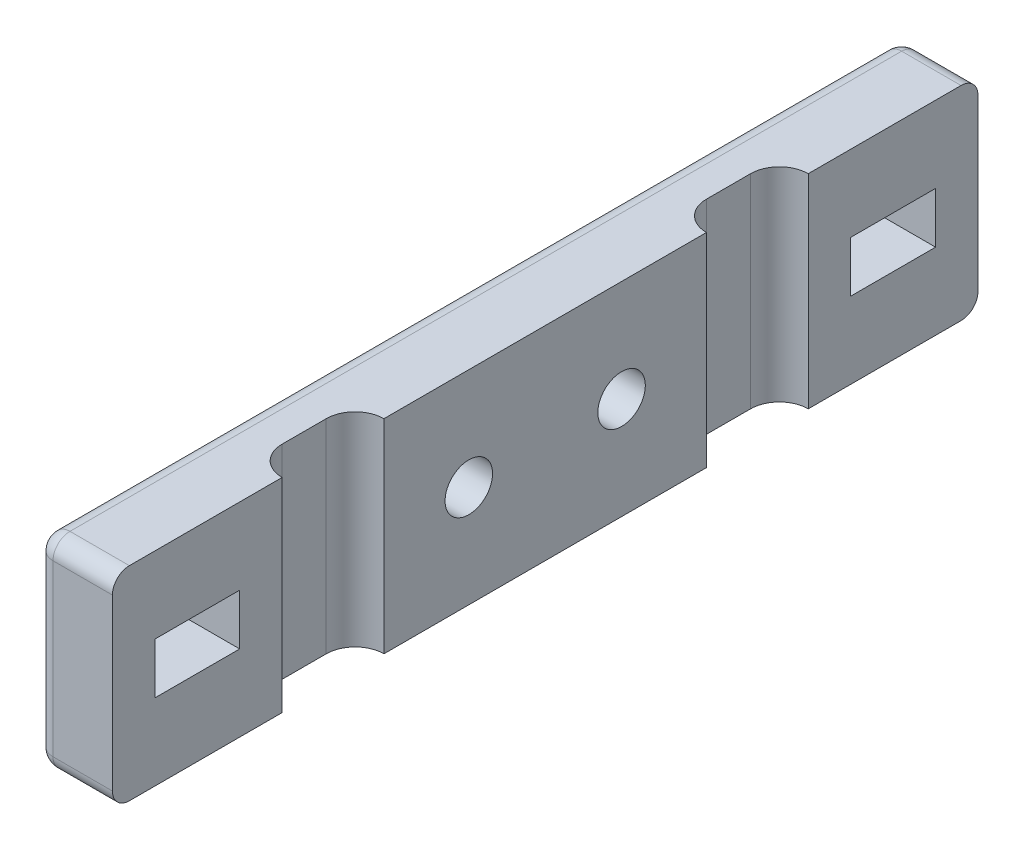
ISO-10303-21;
HEADER;
FILE_DESCRIPTION(('STEP AP214'),'2;1');
FILE_NAME('part.step','',(''),(''),'','','');
FILE_SCHEMA(('AUTOMOTIVE_DESIGN { 1 0 10303 214 1 1 1 1 }'));
ENDSEC;
DATA;
#1=APPLICATION_CONTEXT('core data for automotive mechanical design processes');
#2=APPLICATION_PROTOCOL_DEFINITION('international standard','automotive_design',2000,#1);
#3=PRODUCT_CONTEXT('',#1,'mechanical');
#4=PRODUCT('Part','Part','',(#3));
#5=PRODUCT_RELATED_PRODUCT_CATEGORY('part','',(#4));
#6=PRODUCT_DEFINITION_FORMATION('','',#4);
#7=PRODUCT_DEFINITION_CONTEXT('part definition',#1,'design');
#8=PRODUCT_DEFINITION('design','',#6,#7);
#9=PRODUCT_DEFINITION_SHAPE('','',#8);
#10=(LENGTH_UNIT() NAMED_UNIT(*) SI_UNIT(.MILLI.,.METRE.));
#11=(NAMED_UNIT(*) PLANE_ANGLE_UNIT() SI_UNIT($,.RADIAN.));
#12=(NAMED_UNIT(*) SI_UNIT($,.STERADIAN.) SOLID_ANGLE_UNIT());
#13=UNCERTAINTY_MEASURE_WITH_UNIT(LENGTH_MEASURE(1.E-05),#10,'distance_accuracy_value','');
#14=(GEOMETRIC_REPRESENTATION_CONTEXT(3) GLOBAL_UNCERTAINTY_ASSIGNED_CONTEXT((#13)) GLOBAL_UNIT_ASSIGNED_CONTEXT((#10,
#11,#12)) REPRESENTATION_CONTEXT('',''));
#15=CARTESIAN_POINT('',(0.,0.,0.));
#16=DIRECTION('',(0.,0.,1.));
#17=DIRECTION('',(1.,0.,0.));
#18=AXIS2_PLACEMENT_3D('',#15,#16,#17);
#19=CARTESIAN_POINT('',(0.,12.,-25.5));
#20=DIRECTION('',(1.,0.,0.));
#21=DIRECTION('',(0.,0.,-1.));
#22=AXIS2_PLACEMENT_3D('',#19,#20,#21);
#23=PLANE('',#22);
#24=DIRECTION('',(0.,-1.,0.));
#25=VECTOR('',#24,1.);
#26=CARTESIAN_POINT('',(0.,12.,-24.5));
#27=LINE('',#26,#25);
#28=CARTESIAN_POINT('',(0.,11.,-24.5));
#29=VERTEX_POINT('',#28);
#30=CARTESIAN_POINT('',(0.,1.,-24.5));
#31=VERTEX_POINT('',#30);
#32=EDGE_CURVE('E351',#29,#31,#27,.T.);
#33=ORIENTED_EDGE('',*,*,#32,.T.);
#34=DIRECTION('',(0.,0.,1.));
#35=VECTOR('',#34,1.);
#36=CARTESIAN_POINT('',(0.,1.,-25.5));
#37=LINE('',#36,#35);
#38=CARTESIAN_POINT('',(0.,1.,24.5));
#39=VERTEX_POINT('',#38);
#40=EDGE_CURVE('E355',#31,#39,#37,.T.);
#41=ORIENTED_EDGE('',*,*,#40,.T.);
#42=DIRECTION('',(0.,-1.,0.));
#43=VECTOR('',#42,1.);
#44=CARTESIAN_POINT('',(0.,12.,24.5));
#45=LINE('',#44,#43);
#46=CARTESIAN_POINT('',(0.,11.,24.5));
#47=VERTEX_POINT('',#46);
#48=EDGE_CURVE('E353',#39,#47,#45,.F.);
#49=ORIENTED_EDGE('',*,*,#48,.T.);
#50=DIRECTION('',(0.,0.,1.));
#51=VECTOR('',#50,1.);
#52=CARTESIAN_POINT('',(0.,11.,-25.5));
#53=LINE('',#52,#51);
#54=EDGE_CURVE('E349',#47,#29,#53,.F.);
#55=ORIENTED_EDGE('',*,*,#54,.T.);
#56=EDGE_LOOP('',(#33,#41,#49,#55));
#57=FACE_BOUND('',#56,.T.);
#58=DIRECTION('',(0.,0.,1.));
#59=VECTOR('',#58,1.);
#60=CARTESIAN_POINT('',(0.,4.5,18.));
#61=LINE('',#60,#59);
#62=CARTESIAN_POINT('',(0.,4.5,18.));
#63=VERTEX_POINT('',#62);
#64=CARTESIAN_POINT('',(0.,4.5,23.));
#65=VERTEX_POINT('',#64);
#66=EDGE_CURVE('E273',#63,#65,#61,.T.);
#67=ORIENTED_EDGE('',*,*,#66,.F.);
#68=DIRECTION('',(0.,-1.,0.));
#69=VECTOR('',#68,1.);
#70=CARTESIAN_POINT('',(0.,7.5,18.));
#71=LINE('',#70,#69);
#72=CARTESIAN_POINT('',(0.,7.5,18.));
#73=VERTEX_POINT('',#72);
#74=EDGE_CURVE('E270',#73,#63,#71,.T.);
#75=ORIENTED_EDGE('',*,*,#74,.F.);
#76=DIRECTION('',(0.,0.,-1.));
#77=VECTOR('',#76,1.);
#78=CARTESIAN_POINT('',(0.,7.5,18.));
#79=LINE('',#78,#77);
#80=CARTESIAN_POINT('',(0.,7.5,23.));
#81=VERTEX_POINT('',#80);
#82=EDGE_CURVE('E247',#81,#73,#79,.T.);
#83=ORIENTED_EDGE('',*,*,#82,.F.);
#84=DIRECTION('',(0.,1.,0.));
#85=VECTOR('',#84,1.);
#86=CARTESIAN_POINT('',(0.,7.5,23.));
#87=LINE('',#86,#85);
#88=EDGE_CURVE('E244',#65,#81,#87,.T.);
#89=ORIENTED_EDGE('',*,*,#88,.F.);
#90=EDGE_LOOP('',(#67,#75,#83,#89));
#91=FACE_BOUND('',#90,.T.);
#92=CARTESIAN_POINT('',(0.,6.,-4.5));
#93=DIRECTION('',(1.,0.,0.));
#94=DIRECTION('',(0.,0.,-1.));
#95=AXIS2_PLACEMENT_3D('',#92,#93,#94);
#96=CIRCLE('',#95,1.4);
#97=CARTESIAN_POINT('',(0.,6.,-5.9));
#98=VERTEX_POINT('',#97);
#99=EDGE_CURVE('E240',#98,#98,#96,.F.);
#100=ORIENTED_EDGE('',*,*,#99,.F.);
#101=EDGE_LOOP('',(#100));
#102=FACE_BOUND('',#101,.T.);
#103=DIRECTION('',(0.,0.,-1.));
#104=VECTOR('',#103,1.);
#105=CARTESIAN_POINT('',(0.,7.5,-18.));
#106=LINE('',#105,#104);
#107=CARTESIAN_POINT('',(0.,7.5,-18.));
#108=VERTEX_POINT('',#107);
#109=CARTESIAN_POINT('',(0.,7.5,-23.));
#110=VERTEX_POINT('',#109);
#111=EDGE_CURVE('E214',#108,#110,#106,.T.);
#112=ORIENTED_EDGE('',*,*,#111,.F.);
#113=DIRECTION('',(0.,1.,0.));
#114=VECTOR('',#113,1.);
#115=CARTESIAN_POINT('',(0.,7.5,-18.));
#116=LINE('',#115,#114);
#117=CARTESIAN_POINT('',(0.,4.5,-18.));
#118=VERTEX_POINT('',#117);
#119=EDGE_CURVE('E224',#118,#108,#116,.T.);
#120=ORIENTED_EDGE('',*,*,#119,.F.);
#121=DIRECTION('',(0.,0.,1.));
#122=VECTOR('',#121,1.);
#123=CARTESIAN_POINT('',(0.,4.5,-18.));
#124=LINE('',#123,#122);
#125=CARTESIAN_POINT('',(0.,4.5,-23.));
#126=VERTEX_POINT('',#125);
#127=EDGE_CURVE('E221',#126,#118,#124,.T.);
#128=ORIENTED_EDGE('',*,*,#127,.F.);
#129=DIRECTION('',(0.,-1.,0.));
#130=VECTOR('',#129,1.);
#131=CARTESIAN_POINT('',(0.,7.5,-23.));
#132=LINE('',#131,#130);
#133=EDGE_CURVE('E234',#110,#126,#132,.T.);
#134=ORIENTED_EDGE('',*,*,#133,.F.);
#135=EDGE_LOOP('',(#112,#120,#128,#134));
#136=FACE_BOUND('',#135,.T.);
#137=CARTESIAN_POINT('',(0.,6.,4.5));
#138=DIRECTION('',(1.,0.,0.));
#139=DIRECTION('',(0.,0.,-1.));
#140=AXIS2_PLACEMENT_3D('',#137,#138,#139);
#141=CIRCLE('',#140,1.4);
#142=CARTESIAN_POINT('',(0.,6.,3.1));
#143=VERTEX_POINT('',#142);
#144=EDGE_CURVE('E279',#143,#143,#141,.F.);
#145=ORIENTED_EDGE('',*,*,#144,.F.);
#146=EDGE_LOOP('',(#145));
#147=FACE_BOUND('',#146,.T.);
#148=ADVANCED_FACE('F37',(#57,#91,#102,#136,#147),#23,.F.);
#149=CARTESIAN_POINT('',(0.,12.,25.5));
#150=DIRECTION('',(0.,0.,-1.));
#151=DIRECTION('',(-1.,0.,0.));
#152=AXIS2_PLACEMENT_3D('',#149,#150,#151);
#153=PLANE('',#152);
#154=DIRECTION('',(0.,-1.,0.));
#155=VECTOR('',#154,1.);
#156=CARTESIAN_POINT('',(1.00000000000001,12.,25.5));
#157=LINE('',#156,#155);
#158=CARTESIAN_POINT('',(1.00000000000001,11.,25.5));
#159=VERTEX_POINT('',#158);
#160=CARTESIAN_POINT('',(1.00000000000001,1.,25.5));
#161=VERTEX_POINT('',#160);
#162=EDGE_CURVE('E367',#159,#161,#157,.T.);
#163=ORIENTED_EDGE('',*,*,#162,.T.);
#164=DIRECTION('',(1.,0.,0.));
#165=VECTOR('',#164,1.);
#166=CARTESIAN_POINT('',(0.,1.,25.5));
#167=LINE('',#166,#165);
#168=CARTESIAN_POINT('',(4.5,1.,25.5));
#169=VERTEX_POINT('',#168);
#170=EDGE_CURVE('E369',#161,#169,#167,.T.);
#171=ORIENTED_EDGE('',*,*,#170,.T.);
#172=DIRECTION('',(0.,-1.,0.));
#173=VECTOR('',#172,1.);
#174=CARTESIAN_POINT('',(4.5,12.,25.5));
#175=LINE('',#174,#173);
#176=CARTESIAN_POINT('',(4.5,11.,25.5));
#177=VERTEX_POINT('',#176);
#178=EDGE_CURVE('E346',#177,#169,#175,.T.);
#179=ORIENTED_EDGE('',*,*,#178,.F.);
#180=DIRECTION('',(1.,0.,0.));
#181=VECTOR('',#180,1.);
#182=CARTESIAN_POINT('',(0.,11.,25.5));
#183=LINE('',#182,#181);
#184=EDGE_CURVE('E365',#177,#159,#183,.F.);
#185=ORIENTED_EDGE('',*,*,#184,.T.);
#186=EDGE_LOOP('',(#163,#171,#179,#185));
#187=FACE_BOUND('',#186,.T.);
#188=ADVANCED_FACE('F515',(#187),#153,.F.);
#189=CARTESIAN_POINT('',(4.5,12.,15.5));
#190=DIRECTION('',(-1.,0.,0.));
#191=DIRECTION('',(0.,0.,1.));
#192=AXIS2_PLACEMENT_3D('',#189,#190,#191);
#193=PLANE('',#192);
#194=DIRECTION('',(0.,0.,1.));
#195=VECTOR('',#194,1.);
#196=CARTESIAN_POINT('',(4.5,7.5,18.));
#197=LINE('',#196,#195);
#198=CARTESIAN_POINT('',(4.5,7.5,18.));
#199=VERTEX_POINT('',#198);
#200=CARTESIAN_POINT('',(4.50000000000001,7.5,23.));
#201=VERTEX_POINT('',#200);
#202=EDGE_CURVE('E265',#199,#201,#197,.T.);
#203=ORIENTED_EDGE('',*,*,#202,.F.);
#204=DIRECTION('',(0.,1.,0.));
#205=VECTOR('',#204,1.);
#206=CARTESIAN_POINT('',(4.5,7.5,18.));
#207=LINE('',#206,#205);
#208=CARTESIAN_POINT('',(4.5,4.5,18.));
#209=VERTEX_POINT('',#208);
#210=EDGE_CURVE('E268',#209,#199,#207,.T.);
#211=ORIENTED_EDGE('',*,*,#210,.F.);
#212=DIRECTION('',(0.,0.,-1.));
#213=VECTOR('',#212,1.);
#214=CARTESIAN_POINT('',(4.5,4.5,18.));
#215=LINE('',#214,#213);
#216=CARTESIAN_POINT('',(4.50000000000001,4.5,23.));
#217=VERTEX_POINT('',#216);
#218=EDGE_CURVE('E254',#217,#209,#215,.T.);
#219=ORIENTED_EDGE('',*,*,#218,.F.);
#220=DIRECTION('',(0.,-1.,0.));
#221=VECTOR('',#220,1.);
#222=CARTESIAN_POINT('',(4.50000000000001,7.5,23.));
#223=LINE('',#222,#221);
#224=EDGE_CURVE('E262',#201,#217,#223,.T.);
#225=ORIENTED_EDGE('',*,*,#224,.F.);
#226=EDGE_LOOP('',(#203,#211,#219,#225));
#227=FACE_BOUND('',#226,.T.);
#228=ORIENTED_EDGE('',*,*,#178,.T.);
#229=CARTESIAN_POINT('',(4.5,1.,24.5));
#230=DIRECTION('',(-1.,0.,0.));
#231=DIRECTION('',(0.,0.,1.));
#232=AXIS2_PLACEMENT_3D('',#229,#230,#231);
#233=CIRCLE('',#232,1.);
#234=CARTESIAN_POINT('',(4.5,0.,24.5));
#235=VERTEX_POINT('',#234);
#236=EDGE_CURVE('E11',#169,#235,#233,.F.);
#237=ORIENTED_EDGE('',*,*,#236,.T.);
#238=DIRECTION('',(0.,0.,-1.));
#239=VECTOR('',#238,1.);
#240=CARTESIAN_POINT('',(4.5,0.,15.5));
#241=LINE('',#240,#239);
#242=CARTESIAN_POINT('',(4.5,0.,15.5));
#243=VERTEX_POINT('',#242);
#244=EDGE_CURVE('E282',#235,#243,#241,.T.);
#245=ORIENTED_EDGE('',*,*,#244,.T.);
#246=DIRECTION('',(0.,-1.,0.));
#247=VECTOR('',#246,1.);
#248=CARTESIAN_POINT('',(4.5,12.,15.5));
#249=LINE('',#248,#247);
#250=CARTESIAN_POINT('',(4.5,12.,15.5));
#251=VERTEX_POINT('',#250);
#252=EDGE_CURVE('E343',#251,#243,#249,.T.);
#253=ORIENTED_EDGE('',*,*,#252,.F.);
#254=DIRECTION('',(0.,0.,-1.));
#255=VECTOR('',#254,1.);
#256=CARTESIAN_POINT('',(4.5,12.,15.5));
#257=LINE('',#256,#255);
#258=CARTESIAN_POINT('',(4.5,12.,24.5));
#259=VERTEX_POINT('',#258);
#260=EDGE_CURVE('E283',#259,#251,#257,.T.);
#261=ORIENTED_EDGE('',*,*,#260,.F.);
#262=CARTESIAN_POINT('',(4.5,11.,24.5));
#263=DIRECTION('',(-1.,0.,0.));
#264=DIRECTION('',(0.,0.,1.));
#265=AXIS2_PLACEMENT_3D('',#262,#263,#264);
#266=CIRCLE('',#265,1.);
#267=EDGE_CURVE('E46',#259,#177,#266,.F.);
#268=ORIENTED_EDGE('',*,*,#267,.T.);
#269=EDGE_LOOP('',(#228,#237,#245,#253,#261,#268));
#270=FACE_BOUND('',#269,.T.);
#271=ADVANCED_FACE('F451',(#227,#270),#193,.F.);
#272=CARTESIAN_POINT('',(4.5,12.,13.8));
#273=DIRECTION('',(0.,-1.,0.));
#274=DIRECTION('',(0.,0.,-1.));
#275=AXIS2_PLACEMENT_3D('',#272,#273,#274);
#276=CYLINDRICAL_SURFACE('',#275,1.7);
#277=CARTESIAN_POINT('',(4.5,0.,13.8));
#278=DIRECTION('',(0.,-1.,0.));
#279=DIRECTION('',(0.,0.,1.));
#280=AXIS2_PLACEMENT_3D('',#277,#278,#279);
#281=CIRCLE('',#280,1.7);
#282=CARTESIAN_POINT('',(2.8,0.,13.8));
#283=VERTEX_POINT('',#282);
#284=EDGE_CURVE('E304',#243,#283,#281,.T.);
#285=ORIENTED_EDGE('',*,*,#284,.T.);
#286=DIRECTION('',(0.,-1.,0.));
#287=VECTOR('',#286,1.);
#288=CARTESIAN_POINT('',(2.8,12.,13.8));
#289=LINE('',#288,#287);
#290=CARTESIAN_POINT('',(2.8,12.,13.8));
#291=VERTEX_POINT('',#290);
#292=EDGE_CURVE('E340',#291,#283,#289,.T.);
#293=ORIENTED_EDGE('',*,*,#292,.F.);
#294=CARTESIAN_POINT('',(4.5,12.,13.8));
#295=DIRECTION('',(0.,-1.,0.));
#296=DIRECTION('',(0.,0.,1.));
#297=AXIS2_PLACEMENT_3D('',#294,#295,#296);
#298=CIRCLE('',#297,1.7);
#299=EDGE_CURVE('E285',#251,#291,#298,.T.);
#300=ORIENTED_EDGE('',*,*,#299,.F.);
#301=ORIENTED_EDGE('',*,*,#252,.T.);
#302=EDGE_LOOP('',(#285,#293,#300,#301));
#303=FACE_BOUND('',#302,.T.);
#304=ADVANCED_FACE('F458',(#303),#276,.F.);
#305=CARTESIAN_POINT('',(2.8,12.,13.8));
#306=DIRECTION('',(-1.,0.,0.));
#307=DIRECTION('',(0.,0.,1.));
#308=AXIS2_PLACEMENT_3D('',#305,#306,#307);
#309=PLANE('',#308);
#310=DIRECTION('',(0.,0.,-1.));
#311=VECTOR('',#310,1.);
#312=CARTESIAN_POINT('',(2.8,0.,13.8));
#313=LINE('',#312,#311);
#314=CARTESIAN_POINT('',(2.8,0.,11.2));
#315=VERTEX_POINT('',#314);
#316=EDGE_CURVE('E306',#283,#315,#313,.T.);
#317=ORIENTED_EDGE('',*,*,#316,.T.);
#318=DIRECTION('',(0.,-1.,0.));
#319=VECTOR('',#318,1.);
#320=CARTESIAN_POINT('',(2.8,12.,11.2));
#321=LINE('',#320,#319);
#322=CARTESIAN_POINT('',(2.8,12.,11.2));
#323=VERTEX_POINT('',#322);
#324=EDGE_CURVE('E337',#323,#315,#321,.T.);
#325=ORIENTED_EDGE('',*,*,#324,.F.);
#326=DIRECTION('',(0.,0.,-1.));
#327=VECTOR('',#326,1.);
#328=CARTESIAN_POINT('',(2.8,12.,13.8));
#329=LINE('',#328,#327);
#330=EDGE_CURVE('E288',#291,#323,#329,.T.);
#331=ORIENTED_EDGE('',*,*,#330,.F.);
#332=ORIENTED_EDGE('',*,*,#292,.T.);
#333=EDGE_LOOP('',(#317,#325,#331,#332));
#334=FACE_BOUND('',#333,.T.);
#335=ADVANCED_FACE('F464',(#334),#309,.F.);
#336=CARTESIAN_POINT('',(4.5,12.,11.2));
#337=DIRECTION('',(0.,-1.,0.));
#338=DIRECTION('',(0.,0.,-1.));
#339=AXIS2_PLACEMENT_3D('',#336,#337,#338);
#340=CYLINDRICAL_SURFACE('',#339,1.7);
#341=CARTESIAN_POINT('',(4.5,0.,11.2));
#342=DIRECTION('',(0.,-1.,0.));
#343=DIRECTION('',(0.,0.,-1.));
#344=AXIS2_PLACEMENT_3D('',#341,#342,#343);
#345=CIRCLE('',#344,1.7);
#346=CARTESIAN_POINT('',(4.5,0.,9.5));
#347=VERTEX_POINT('',#346);
#348=EDGE_CURVE('E308',#315,#347,#345,.T.);
#349=ORIENTED_EDGE('',*,*,#348,.T.);
#350=DIRECTION('',(0.,-1.,0.));
#351=VECTOR('',#350,1.);
#352=CARTESIAN_POINT('',(4.5,12.,9.5));
#353=LINE('',#352,#351);
#354=CARTESIAN_POINT('',(4.5,12.,9.5));
#355=VERTEX_POINT('',#354);
#356=EDGE_CURVE('E334',#355,#347,#353,.T.);
#357=ORIENTED_EDGE('',*,*,#356,.F.);
#358=CARTESIAN_POINT('',(4.5,12.,11.2));
#359=DIRECTION('',(0.,-1.,0.));
#360=DIRECTION('',(0.,0.,-1.));
#361=AXIS2_PLACEMENT_3D('',#358,#359,#360);
#362=CIRCLE('',#361,1.7);
#363=EDGE_CURVE('E290',#323,#355,#362,.T.);
#364=ORIENTED_EDGE('',*,*,#363,.F.);
#365=ORIENTED_EDGE('',*,*,#324,.T.);
#366=EDGE_LOOP('',(#349,#357,#364,#365));
#367=FACE_BOUND('',#366,.T.);
#368=ADVANCED_FACE('F468',(#367),#340,.F.);
#369=CARTESIAN_POINT('',(4.5,12.,-9.5));
#370=DIRECTION('',(-1.,0.,0.));
#371=DIRECTION('',(0.,0.,1.));
#372=AXIS2_PLACEMENT_3D('',#369,#370,#371);
#373=PLANE('',#372);
#374=CARTESIAN_POINT('',(4.5,6.,-4.5));
#375=DIRECTION('',(1.,0.,0.));
#376=DIRECTION('',(0.,0.,1.));
#377=AXIS2_PLACEMENT_3D('',#374,#375,#376);
#378=CIRCLE('',#377,1.4);
#379=CARTESIAN_POINT('',(4.5,6.,-3.1));
#380=VERTEX_POINT('',#379);
#381=EDGE_CURVE('E243',#380,#380,#378,.T.);
#382=ORIENTED_EDGE('',*,*,#381,.F.);
#383=EDGE_LOOP('',(#382));
#384=FACE_BOUND('',#383,.T.);
#385=CARTESIAN_POINT('',(4.5,6.,4.5));
#386=DIRECTION('',(1.,0.,0.));
#387=DIRECTION('',(0.,0.,-1.));
#388=AXIS2_PLACEMENT_3D('',#385,#386,#387);
#389=CIRCLE('',#388,1.4);
#390=CARTESIAN_POINT('',(4.5,6.,3.1));
#391=VERTEX_POINT('',#390);
#392=EDGE_CURVE('E236',#391,#391,#389,.T.);
#393=ORIENTED_EDGE('',*,*,#392,.F.);
#394=EDGE_LOOP('',(#393));
#395=FACE_BOUND('',#394,.T.);
#396=DIRECTION('',(0.,0.,-1.));
#397=VECTOR('',#396,1.);
#398=CARTESIAN_POINT('',(4.5,0.,-9.5));
#399=LINE('',#398,#397);
#400=CARTESIAN_POINT('',(4.5,0.,-9.5));
#401=VERTEX_POINT('',#400);
#402=EDGE_CURVE('E310',#347,#401,#399,.T.);
#403=ORIENTED_EDGE('',*,*,#402,.T.);
#404=DIRECTION('',(0.,-1.,0.));
#405=VECTOR('',#404,1.);
#406=CARTESIAN_POINT('',(4.5,12.,-9.5));
#407=LINE('',#406,#405);
#408=CARTESIAN_POINT('',(4.5,12.,-9.5));
#409=VERTEX_POINT('',#408);
#410=EDGE_CURVE('E331',#409,#401,#407,.T.);
#411=ORIENTED_EDGE('',*,*,#410,.F.);
#412=DIRECTION('',(0.,0.,-1.));
#413=VECTOR('',#412,1.);
#414=CARTESIAN_POINT('',(4.5,12.,-9.5));
#415=LINE('',#414,#413);
#416=EDGE_CURVE('E292',#355,#409,#415,.T.);
#417=ORIENTED_EDGE('',*,*,#416,.F.);
#418=ORIENTED_EDGE('',*,*,#356,.T.);
#419=EDGE_LOOP('',(#403,#411,#417,#418));
#420=FACE_BOUND('',#419,.T.);
#421=ADVANCED_FACE('F473',(#384,#395,#420),#373,.F.);
#422=CARTESIAN_POINT('',(4.5,12.,-11.2));
#423=DIRECTION('',(0.,-1.,0.));
#424=DIRECTION('',(0.,0.,-1.));
#425=AXIS2_PLACEMENT_3D('',#422,#423,#424);
#426=CYLINDRICAL_SURFACE('',#425,1.7);
#427=CARTESIAN_POINT('',(4.5,0.,-11.2));
#428=DIRECTION('',(0.,-1.,0.));
#429=DIRECTION('',(0.,0.,1.));
#430=AXIS2_PLACEMENT_3D('',#427,#428,#429);
#431=CIRCLE('',#430,1.7);
#432=CARTESIAN_POINT('',(2.8,0.,-11.2));
#433=VERTEX_POINT('',#432);
#434=EDGE_CURVE('E312',#401,#433,#431,.T.);
#435=ORIENTED_EDGE('',*,*,#434,.T.);
#436=DIRECTION('',(0.,-1.,0.));
#437=VECTOR('',#436,1.);
#438=CARTESIAN_POINT('',(2.8,12.,-11.2));
#439=LINE('',#438,#437);
#440=CARTESIAN_POINT('',(2.8,12.,-11.2));
#441=VERTEX_POINT('',#440);
#442=EDGE_CURVE('E328',#441,#433,#439,.T.);
#443=ORIENTED_EDGE('',*,*,#442,.F.);
#444=CARTESIAN_POINT('',(4.5,12.,-11.2));
#445=DIRECTION('',(0.,-1.,0.));
#446=DIRECTION('',(0.,0.,1.));
#447=AXIS2_PLACEMENT_3D('',#444,#445,#446);
#448=CIRCLE('',#447,1.7);
#449=EDGE_CURVE('E294',#409,#441,#448,.T.);
#450=ORIENTED_EDGE('',*,*,#449,.F.);
#451=ORIENTED_EDGE('',*,*,#410,.T.);
#452=EDGE_LOOP('',(#435,#443,#450,#451));
#453=FACE_BOUND('',#452,.T.);
#454=ADVANCED_FACE('F479',(#453),#426,.F.);
#455=CARTESIAN_POINT('',(2.8,12.,-11.2));
#456=DIRECTION('',(-1.,0.,0.));
#457=DIRECTION('',(0.,0.,1.));
#458=AXIS2_PLACEMENT_3D('',#455,#456,#457);
#459=PLANE('',#458);
#460=DIRECTION('',(0.,0.,-1.));
#461=VECTOR('',#460,1.);
#462=CARTESIAN_POINT('',(2.8,0.,-11.2));
#463=LINE('',#462,#461);
#464=CARTESIAN_POINT('',(2.8,0.,-13.8));
#465=VERTEX_POINT('',#464);
#466=EDGE_CURVE('E314',#433,#465,#463,.T.);
#467=ORIENTED_EDGE('',*,*,#466,.T.);
#468=DIRECTION('',(0.,-1.,0.));
#469=VECTOR('',#468,1.);
#470=CARTESIAN_POINT('',(2.8,12.,-13.8));
#471=LINE('',#470,#469);
#472=CARTESIAN_POINT('',(2.8,12.,-13.8));
#473=VERTEX_POINT('',#472);
#474=EDGE_CURVE('E325',#473,#465,#471,.T.);
#475=ORIENTED_EDGE('',*,*,#474,.F.);
#476=DIRECTION('',(0.,0.,-1.));
#477=VECTOR('',#476,1.);
#478=CARTESIAN_POINT('',(2.8,12.,-11.2));
#479=LINE('',#478,#477);
#480=EDGE_CURVE('E296',#441,#473,#479,.T.);
#481=ORIENTED_EDGE('',*,*,#480,.F.);
#482=ORIENTED_EDGE('',*,*,#442,.T.);
#483=EDGE_LOOP('',(#467,#475,#481,#482));
#484=FACE_BOUND('',#483,.T.);
#485=ADVANCED_FACE('F483',(#484),#459,.F.);
#486=CARTESIAN_POINT('',(4.5,12.,-13.8));
#487=DIRECTION('',(0.,-1.,0.));
#488=DIRECTION('',(0.,0.,-1.));
#489=AXIS2_PLACEMENT_3D('',#486,#487,#488);
#490=CYLINDRICAL_SURFACE('',#489,1.7);
#491=CARTESIAN_POINT('',(4.5,0.,-13.8));
#492=DIRECTION('',(0.,-1.,0.));
#493=DIRECTION('',(0.,0.,-1.));
#494=AXIS2_PLACEMENT_3D('',#491,#492,#493);
#495=CIRCLE('',#494,1.7);
#496=CARTESIAN_POINT('',(4.5,0.,-15.5));
#497=VERTEX_POINT('',#496);
#498=EDGE_CURVE('E316',#465,#497,#495,.T.);
#499=ORIENTED_EDGE('',*,*,#498,.T.);
#500=DIRECTION('',(0.,-1.,0.));
#501=VECTOR('',#500,1.);
#502=CARTESIAN_POINT('',(4.5,12.,-15.5));
#503=LINE('',#502,#501);
#504=CARTESIAN_POINT('',(4.5,12.,-15.5));
#505=VERTEX_POINT('',#504);
#506=EDGE_CURVE('E322',#505,#497,#503,.T.);
#507=ORIENTED_EDGE('',*,*,#506,.F.);
#508=CARTESIAN_POINT('',(4.5,12.,-13.8));
#509=DIRECTION('',(0.,-1.,0.));
#510=DIRECTION('',(0.,0.,-1.));
#511=AXIS2_PLACEMENT_3D('',#508,#509,#510);
#512=CIRCLE('',#511,1.7);
#513=EDGE_CURVE('E298',#473,#505,#512,.T.);
#514=ORIENTED_EDGE('',*,*,#513,.F.);
#515=ORIENTED_EDGE('',*,*,#474,.T.);
#516=EDGE_LOOP('',(#499,#507,#514,#515));
#517=FACE_BOUND('',#516,.T.);
#518=ADVANCED_FACE('F488',(#517),#490,.F.);
#519=CARTESIAN_POINT('',(4.5,12.,-25.5));
#520=DIRECTION('',(-1.,0.,0.));
#521=DIRECTION('',(0.,0.,1.));
#522=AXIS2_PLACEMENT_3D('',#519,#520,#521);
#523=PLANE('',#522);
#524=DIRECTION('',(0.,0.,-1.));
#525=VECTOR('',#524,1.);
#526=CARTESIAN_POINT('',(4.5,4.5,-18.));
#527=LINE('',#526,#525);
#528=CARTESIAN_POINT('',(4.5,4.5,-18.));
#529=VERTEX_POINT('',#528);
#530=CARTESIAN_POINT('',(4.5,4.5,-23.));
#531=VERTEX_POINT('',#530);
#532=EDGE_CURVE('E922',#529,#531,#527,.T.);
#533=ORIENTED_EDGE('',*,*,#532,.F.);
#534=DIRECTION('',(0.,-1.,0.));
#535=VECTOR('',#534,1.);
#536=CARTESIAN_POINT('',(4.5,7.5,-18.));
#537=LINE('',#536,#535);
#538=CARTESIAN_POINT('',(4.5,7.5,-18.));
#539=VERTEX_POINT('',#538);
#540=EDGE_CURVE('E231',#539,#529,#537,.T.);
#541=ORIENTED_EDGE('',*,*,#540,.F.);
#542=DIRECTION('',(0.,0.,1.));
#543=VECTOR('',#542,1.);
#544=CARTESIAN_POINT('',(4.5,7.5,-18.));
#545=LINE('',#544,#543);
#546=CARTESIAN_POINT('',(4.5,7.5,-23.));
#547=VERTEX_POINT('',#546);
#548=EDGE_CURVE('E217',#547,#539,#545,.T.);
#549=ORIENTED_EDGE('',*,*,#548,.F.);
#550=DIRECTION('',(0.,1.,0.));
#551=VECTOR('',#550,1.);
#552=CARTESIAN_POINT('',(4.5,7.5,-23.));
#553=LINE('',#552,#551);
#554=EDGE_CURVE('E930',#531,#547,#553,.T.);
#555=ORIENTED_EDGE('',*,*,#554,.F.);
#556=EDGE_LOOP('',(#533,#541,#549,#555));
#557=FACE_BOUND('',#556,.T.);
#558=DIRECTION('',(0.,-1.,0.));
#559=VECTOR('',#558,1.);
#560=CARTESIAN_POINT('',(4.5,12.,-25.5));
#561=LINE('',#560,#559);
#562=CARTESIAN_POINT('',(4.5,11.,-25.5));
#563=VERTEX_POINT('',#562);
#564=CARTESIAN_POINT('',(4.5,1.,-25.5));
#565=VERTEX_POINT('',#564);
#566=EDGE_CURVE('E302',#563,#565,#561,.T.);
#567=ORIENTED_EDGE('',*,*,#566,.F.);
#568=CARTESIAN_POINT('',(4.5,11.,-24.5));
#569=DIRECTION('',(-1.,0.,0.));
#570=DIRECTION('',(0.,0.,1.));
#571=AXIS2_PLACEMENT_3D('',#568,#569,#570);
#572=CIRCLE('',#571,1.);
#573=CARTESIAN_POINT('',(4.5,12.,-24.5));
#574=VERTEX_POINT('',#573);
#575=EDGE_CURVE('E383',#563,#574,#572,.F.);
#576=ORIENTED_EDGE('',*,*,#575,.T.);
#577=DIRECTION('',(0.,0.,-1.));
#578=VECTOR('',#577,1.);
#579=CARTESIAN_POINT('',(4.5,12.,-25.5));
#580=LINE('',#579,#578);
#581=EDGE_CURVE('E300',#505,#574,#580,.T.);
#582=ORIENTED_EDGE('',*,*,#581,.F.);
#583=ORIENTED_EDGE('',*,*,#506,.T.);
#584=DIRECTION('',(0.,0.,-1.));
#585=VECTOR('',#584,1.);
#586=CARTESIAN_POINT('',(4.5,0.,-25.5));
#587=LINE('',#586,#585);
#588=CARTESIAN_POINT('',(4.5,0.,-24.5));
#589=VERTEX_POINT('',#588);
#590=EDGE_CURVE('E286',#497,#589,#587,.T.);
#591=ORIENTED_EDGE('',*,*,#590,.T.);
#592=CARTESIAN_POINT('',(4.5,1.,-24.5));
#593=DIRECTION('',(-1.,0.,0.));
#594=DIRECTION('',(0.,0.,1.));
#595=AXIS2_PLACEMENT_3D('',#592,#593,#594);
#596=CIRCLE('',#595,1.);
#597=EDGE_CURVE('E381',#589,#565,#596,.F.);
#598=ORIENTED_EDGE('',*,*,#597,.T.);
#599=EDGE_LOOP('',(#567,#576,#582,#583,#591,#598));
#600=FACE_BOUND('',#599,.T.);
#601=ADVANCED_FACE('F493',(#557,#600),#523,.F.);
#602=CARTESIAN_POINT('',(0.,12.,-25.5));
#603=DIRECTION('',(0.,0.,1.));
#604=DIRECTION('',(1.,0.,0.));
#605=AXIS2_PLACEMENT_3D('',#602,#603,#604);
#606=PLANE('',#605);
#607=DIRECTION('',(0.,-1.,0.));
#608=VECTOR('',#607,1.);
#609=CARTESIAN_POINT('',(1.00000000000001,12.,-25.5));
#610=LINE('',#609,#608);
#611=CARTESIAN_POINT('',(1.00000000000001,1.,-25.5));
#612=VERTEX_POINT('',#611);
#613=CARTESIAN_POINT('',(1.00000000000001,11.,-25.5));
#614=VERTEX_POINT('',#613);
#615=EDGE_CURVE('E373',#612,#614,#610,.F.);
#616=ORIENTED_EDGE('',*,*,#615,.T.);
#617=DIRECTION('',(-1.,0.,0.));
#618=VECTOR('',#617,1.);
#619=CARTESIAN_POINT('',(4.5,11.,-25.5));
#620=LINE('',#619,#618);
#621=EDGE_CURVE('E375',#614,#563,#620,.F.);
#622=ORIENTED_EDGE('',*,*,#621,.T.);
#623=ORIENTED_EDGE('',*,*,#566,.T.);
#624=DIRECTION('',(-1.,0.,0.));
#625=VECTOR('',#624,1.);
#626=CARTESIAN_POINT('',(0.,1.,-25.5));
#627=LINE('',#626,#625);
#628=EDGE_CURVE('E371',#565,#612,#627,.T.);
#629=ORIENTED_EDGE('',*,*,#628,.T.);
#630=EDGE_LOOP('',(#616,#622,#623,#629));
#631=FACE_BOUND('',#630,.T.);
#632=ADVANCED_FACE('F497',(#631),#606,.F.);
#633=CARTESIAN_POINT('',(4.5,12.,13.8));
#634=DIRECTION('',(0.,1.,0.));
#635=DIRECTION('',(0.,0.,1.));
#636=AXIS2_PLACEMENT_3D('',#633,#634,#635);
#637=PLANE('',#636);
#638=ORIENTED_EDGE('',*,*,#581,.T.);
#639=DIRECTION('',(-1.,0.,0.));
#640=VECTOR('',#639,1.);
#641=CARTESIAN_POINT('',(0.,12.,-24.5));
#642=LINE('',#641,#640);
#643=CARTESIAN_POINT('',(1.00000000000001,12.,-24.5));
#644=VERTEX_POINT('',#643);
#645=EDGE_CURVE('E54',#574,#644,#642,.T.);
#646=ORIENTED_EDGE('',*,*,#645,.T.);
#647=DIRECTION('',(0.,0.,1.));
#648=VECTOR('',#647,1.);
#649=CARTESIAN_POINT('',(1.00000000000001,12.,25.5));
#650=LINE('',#649,#648);
#651=CARTESIAN_POINT('',(1.00000000000001,12.,24.5));
#652=VERTEX_POINT('',#651);
#653=EDGE_CURVE('E58',#644,#652,#650,.T.);
#654=ORIENTED_EDGE('',*,*,#653,.T.);
#655=DIRECTION('',(1.,0.,0.));
#656=VECTOR('',#655,1.);
#657=CARTESIAN_POINT('',(4.5,12.,24.5));
#658=LINE('',#657,#656);
#659=EDGE_CURVE('E377',#652,#259,#658,.T.);
#660=ORIENTED_EDGE('',*,*,#659,.T.);
#661=ORIENTED_EDGE('',*,*,#260,.T.);
#662=ORIENTED_EDGE('',*,*,#299,.T.);
#663=ORIENTED_EDGE('',*,*,#330,.T.);
#664=ORIENTED_EDGE('',*,*,#363,.T.);
#665=ORIENTED_EDGE('',*,*,#416,.T.);
#666=ORIENTED_EDGE('',*,*,#449,.T.);
#667=ORIENTED_EDGE('',*,*,#480,.T.);
#668=ORIENTED_EDGE('',*,*,#513,.T.);
#669=EDGE_LOOP('',(#638,#646,#654,#660,#661,#662,#663,#664,#665,#666,#667,#668));
#670=FACE_BOUND('',#669,.T.);
#671=ADVANCED_FACE('F448',(#670),#637,.T.);
#672=CARTESIAN_POINT('',(4.5,0.,13.8));
#673=DIRECTION('',(0.,1.,0.));
#674=DIRECTION('',(0.,0.,1.));
#675=AXIS2_PLACEMENT_3D('',#672,#673,#674);
#676=PLANE('',#675);
#677=DIRECTION('',(0.,0.,1.));
#678=VECTOR('',#677,1.);
#679=CARTESIAN_POINT('',(1.00000000000001,0.,13.8));
#680=LINE('',#679,#678);
#681=CARTESIAN_POINT('',(1.00000000000001,0.,24.5));
#682=VERTEX_POINT('',#681);
#683=CARTESIAN_POINT('',(1.00000000000001,0.,-24.5));
#684=VERTEX_POINT('',#683);
#685=EDGE_CURVE('E360',#682,#684,#680,.F.);
#686=ORIENTED_EDGE('',*,*,#685,.T.);
#687=DIRECTION('',(-1.,0.,0.));
#688=VECTOR('',#687,1.);
#689=CARTESIAN_POINT('',(4.5,0.,-24.5));
#690=LINE('',#689,#688);
#691=EDGE_CURVE('E363',#684,#589,#690,.F.);
#692=ORIENTED_EDGE('',*,*,#691,.T.);
#693=ORIENTED_EDGE('',*,*,#590,.F.);
#694=ORIENTED_EDGE('',*,*,#498,.F.);
#695=ORIENTED_EDGE('',*,*,#466,.F.);
#696=ORIENTED_EDGE('',*,*,#434,.F.);
#697=ORIENTED_EDGE('',*,*,#402,.F.);
#698=ORIENTED_EDGE('',*,*,#348,.F.);
#699=ORIENTED_EDGE('',*,*,#316,.F.);
#700=ORIENTED_EDGE('',*,*,#284,.F.);
#701=ORIENTED_EDGE('',*,*,#244,.F.);
#702=DIRECTION('',(1.,0.,0.));
#703=VECTOR('',#702,1.);
#704=CARTESIAN_POINT('',(4.5,0.,24.5));
#705=LINE('',#704,#703);
#706=EDGE_CURVE('E358',#235,#682,#705,.F.);
#707=ORIENTED_EDGE('',*,*,#706,.T.);
#708=EDGE_LOOP('',(#686,#692,#693,#694,#695,#696,#697,#698,#699,#700,#701,#707));
#709=FACE_BOUND('',#708,.T.);
#710=ADVANCED_FACE('F521',(#709),#676,.F.);
#711=CARTESIAN_POINT('',(-0.00100000000000187,7.5,-18.));
#712=DIRECTION('',(0.,0.,1.));
#713=DIRECTION('',(1.,0.,0.));
#714=AXIS2_PLACEMENT_3D('',#711,#712,#713);
#715=PLANE('',#714);
#716=ORIENTED_EDGE('',*,*,#119,.T.);
#717=DIRECTION('',(1.,0.,0.));
#718=VECTOR('',#717,1.);
#719=CARTESIAN_POINT('',(-0.00100000000000187,7.5,-18.));
#720=LINE('',#719,#718);
#721=EDGE_CURVE('E210',#108,#539,#720,.T.);
#722=ORIENTED_EDGE('',*,*,#721,.T.);
#723=ORIENTED_EDGE('',*,*,#540,.T.);
#724=DIRECTION('',(1.,0.,0.));
#725=VECTOR('',#724,1.);
#726=CARTESIAN_POINT('',(-0.00100000000000187,4.5,-18.));
#727=LINE('',#726,#725);
#728=EDGE_CURVE('E227',#118,#529,#727,.T.);
#729=ORIENTED_EDGE('',*,*,#728,.F.);
#730=EDGE_LOOP('',(#716,#722,#723,#729));
#731=FACE_BOUND('',#730,.T.);
#732=ADVANCED_FACE('F225',(#731),#715,.F.);
#733=CARTESIAN_POINT('',(-0.00100000000000187,7.5,-18.));
#734=DIRECTION('',(0.,1.,0.));
#735=DIRECTION('',(0.,0.,1.));
#736=AXIS2_PLACEMENT_3D('',#733,#734,#735);
#737=PLANE('',#736);
#738=ORIENTED_EDGE('',*,*,#111,.T.);
#739=DIRECTION('',(1.,0.,0.));
#740=VECTOR('',#739,1.);
#741=CARTESIAN_POINT('',(-0.00100000000000273,7.5,-23.));
#742=LINE('',#741,#740);
#743=EDGE_CURVE('E220',#110,#547,#742,.T.);
#744=ORIENTED_EDGE('',*,*,#743,.T.);
#745=ORIENTED_EDGE('',*,*,#548,.T.);
#746=ORIENTED_EDGE('',*,*,#721,.F.);
#747=EDGE_LOOP('',(#738,#744,#745,#746));
#748=FACE_BOUND('',#747,.T.);
#749=ADVANCED_FACE('F212',(#748),#737,.F.);
#750=CARTESIAN_POINT('',(-0.00100000000000273,7.5,-23.));
#751=DIRECTION('',(0.,0.,-1.));
#752=DIRECTION('',(-1.,0.,0.));
#753=AXIS2_PLACEMENT_3D('',#750,#751,#752);
#754=PLANE('',#753);
#755=ORIENTED_EDGE('',*,*,#133,.T.);
#756=DIRECTION('',(1.,0.,0.));
#757=VECTOR('',#756,1.);
#758=CARTESIAN_POINT('',(-0.00100000000000273,4.5,-23.));
#759=LINE('',#758,#757);
#760=EDGE_CURVE('E919',#126,#531,#759,.T.);
#761=ORIENTED_EDGE('',*,*,#760,.T.);
#762=ORIENTED_EDGE('',*,*,#554,.T.);
#763=ORIENTED_EDGE('',*,*,#743,.F.);
#764=EDGE_LOOP('',(#755,#761,#762,#763));
#765=FACE_BOUND('',#764,.T.);
#766=ADVANCED_FACE('F593',(#765),#754,.F.);
#767=CARTESIAN_POINT('',(-0.00100000000000187,4.5,-18.));
#768=DIRECTION('',(0.,-1.,0.));
#769=DIRECTION('',(0.,0.,-1.));
#770=AXIS2_PLACEMENT_3D('',#767,#768,#769);
#771=PLANE('',#770);
#772=ORIENTED_EDGE('',*,*,#127,.T.);
#773=ORIENTED_EDGE('',*,*,#728,.T.);
#774=ORIENTED_EDGE('',*,*,#532,.T.);
#775=ORIENTED_EDGE('',*,*,#760,.F.);
#776=EDGE_LOOP('',(#772,#773,#774,#775));
#777=FACE_BOUND('',#776,.T.);
#778=ADVANCED_FACE('F586',(#777),#771,.F.);
#779=CARTESIAN_POINT('',(-0.000999999999998398,6.,4.5));
#780=DIRECTION('',(1.,0.,0.));
#781=DIRECTION('',(0.,0.,-1.));
#782=AXIS2_PLACEMENT_3D('',#779,#780,#781);
#783=CYLINDRICAL_SURFACE('',#782,1.4);
#784=ORIENTED_EDGE('',*,*,#392,.T.);
#785=EDGE_LOOP('',(#784));
#786=FACE_BOUND('',#785,.T.);
#787=ORIENTED_EDGE('',*,*,#144,.T.);
#788=EDGE_LOOP('',(#787));
#789=FACE_BOUND('',#788,.T.);
#790=ADVANCED_FACE('F583',(#786,#789),#783,.F.);
#791=CARTESIAN_POINT('',(-0.00100000000000013,6.,-4.5));
#792=DIRECTION('',(1.,0.,0.));
#793=DIRECTION('',(0.,0.,-1.));
#794=AXIS2_PLACEMENT_3D('',#791,#792,#793);
#795=CYLINDRICAL_SURFACE('',#794,1.4);
#796=ORIENTED_EDGE('',*,*,#381,.T.);
#797=EDGE_LOOP('',(#796));
#798=FACE_BOUND('',#797,.T.);
#799=ORIENTED_EDGE('',*,*,#99,.T.);
#800=EDGE_LOOP('',(#799));
#801=FACE_BOUND('',#800,.T.);
#802=ADVANCED_FACE('F585',(#798,#801),#795,.F.);
#803=CARTESIAN_POINT('',(-0.000999999999996663,7.5,18.));
#804=DIRECTION('',(0.,0.,-1.));
#805=DIRECTION('',(-1.,0.,0.));
#806=AXIS2_PLACEMENT_3D('',#803,#804,#805);
#807=PLANE('',#806);
#808=ORIENTED_EDGE('',*,*,#74,.T.);
#809=DIRECTION('',(1.,0.,0.));
#810=VECTOR('',#809,1.);
#811=CARTESIAN_POINT('',(-0.000999999999996663,4.5,18.));
#812=LINE('',#811,#810);
#813=EDGE_CURVE('E250',#63,#209,#812,.T.);
#814=ORIENTED_EDGE('',*,*,#813,.T.);
#815=ORIENTED_EDGE('',*,*,#210,.T.);
#816=DIRECTION('',(1.,0.,0.));
#817=VECTOR('',#816,1.);
#818=CARTESIAN_POINT('',(-0.000999999999996663,7.5,18.));
#819=LINE('',#818,#817);
#820=EDGE_CURVE('E251',#73,#199,#819,.T.);
#821=ORIENTED_EDGE('',*,*,#820,.F.);
#822=EDGE_LOOP('',(#808,#814,#815,#821));
#823=FACE_BOUND('',#822,.T.);
#824=ADVANCED_FACE('F577',(#823),#807,.F.);
#825=CARTESIAN_POINT('',(-0.000999999999996663,4.5,18.));
#826=DIRECTION('',(0.,-1.,0.));
#827=DIRECTION('',(0.,0.,-1.));
#828=AXIS2_PLACEMENT_3D('',#825,#826,#827);
#829=PLANE('',#828);
#830=ORIENTED_EDGE('',*,*,#66,.T.);
#831=DIRECTION('',(1.,0.,0.));
#832=VECTOR('',#831,1.);
#833=CARTESIAN_POINT('',(-0.000999999999995796,4.5,23.));
#834=LINE('',#833,#832);
#835=EDGE_CURVE('E257',#65,#217,#834,.T.);
#836=ORIENTED_EDGE('',*,*,#835,.T.);
#837=ORIENTED_EDGE('',*,*,#218,.T.);
#838=ORIENTED_EDGE('',*,*,#813,.F.);
#839=EDGE_LOOP('',(#830,#836,#837,#838));
#840=FACE_BOUND('',#839,.T.);
#841=ADVANCED_FACE('F573',(#840),#829,.F.);
#842=CARTESIAN_POINT('',(-0.000999999999995796,7.5,23.));
#843=DIRECTION('',(0.,0.,1.));
#844=DIRECTION('',(1.,0.,0.));
#845=AXIS2_PLACEMENT_3D('',#842,#843,#844);
#846=PLANE('',#845);
#847=ORIENTED_EDGE('',*,*,#88,.T.);
#848=DIRECTION('',(1.,0.,0.));
#849=VECTOR('',#848,1.);
#850=CARTESIAN_POINT('',(-0.000999999999995796,7.5,23.));
#851=LINE('',#850,#849);
#852=EDGE_CURVE('E255',#81,#201,#851,.T.);
#853=ORIENTED_EDGE('',*,*,#852,.T.);
#854=ORIENTED_EDGE('',*,*,#224,.T.);
#855=ORIENTED_EDGE('',*,*,#835,.F.);
#856=EDGE_LOOP('',(#847,#853,#854,#855));
#857=FACE_BOUND('',#856,.T.);
#858=ADVANCED_FACE('F567',(#857),#846,.F.);
#859=CARTESIAN_POINT('',(-0.000999999999996663,7.5,18.));
#860=DIRECTION('',(0.,1.,0.));
#861=DIRECTION('',(0.,0.,1.));
#862=AXIS2_PLACEMENT_3D('',#859,#860,#861);
#863=PLANE('',#862);
#864=ORIENTED_EDGE('',*,*,#82,.T.);
#865=ORIENTED_EDGE('',*,*,#820,.T.);
#866=ORIENTED_EDGE('',*,*,#202,.T.);
#867=ORIENTED_EDGE('',*,*,#852,.F.);
#868=EDGE_LOOP('',(#864,#865,#866,#867));
#869=FACE_BOUND('',#868,.T.);
#870=ADVANCED_FACE('F563',(#869),#863,.F.);
#871=CARTESIAN_POINT('',(4.5,11.,-24.5));
#872=DIRECTION('',(1.,0.,0.));
#873=DIRECTION('',(0.,0.,-1.));
#874=AXIS2_PLACEMENT_3D('',#871,#872,#873);
#875=CYLINDRICAL_SURFACE('',#874,1.);
#876=ORIENTED_EDGE('',*,*,#575,.F.);
#877=ORIENTED_EDGE('',*,*,#621,.F.);
#878=CARTESIAN_POINT('',(1.00000000000001,11.,-24.5));
#879=DIRECTION('',(-1.,0.,0.));
#880=DIRECTION('',(0.,0.,1.));
#881=AXIS2_PLACEMENT_3D('',#878,#879,#880);
#882=CIRCLE('',#881,1.);
#883=EDGE_CURVE('E41',#644,#614,#882,.T.);
#884=ORIENTED_EDGE('',*,*,#883,.F.);
#885=ORIENTED_EDGE('',*,*,#645,.F.);
#886=EDGE_LOOP('',(#876,#877,#884,#885));
#887=FACE_BOUND('',#886,.T.);
#888=ADVANCED_FACE('F39',(#887),#875,.T.);
#889=CARTESIAN_POINT('',(1.00000000000001,11.,13.8));
#890=DIRECTION('',(0.,0.,-1.));
#891=DIRECTION('',(-1.,0.,0.));
#892=AXIS2_PLACEMENT_3D('',#889,#890,#891);
#893=CYLINDRICAL_SURFACE('',#892,1.);
#894=CARTESIAN_POINT('',(1.00000000000001,11.,24.5));
#895=DIRECTION('',(0.,0.,1.));
#896=DIRECTION('',(1.,0.,0.));
#897=AXIS2_PLACEMENT_3D('',#894,#895,#896);
#898=CIRCLE('',#897,1.);
#899=EDGE_CURVE('E411',#652,#47,#898,.T.);
#900=ORIENTED_EDGE('',*,*,#899,.F.);
#901=ORIENTED_EDGE('',*,*,#653,.F.);
#902=CARTESIAN_POINT('',(1.00000000000001,11.,-24.5));
#903=DIRECTION('',(0.,0.,-1.));
#904=DIRECTION('',(0.,1.,0.));
#905=AXIS2_PLACEMENT_3D('',#902,#903,#904);
#906=CIRCLE('',#905,1.);
#907=EDGE_CURVE('E413',#29,#644,#906,.T.);
#908=ORIENTED_EDGE('',*,*,#907,.F.);
#909=ORIENTED_EDGE('',*,*,#54,.F.);
#910=EDGE_LOOP('',(#900,#901,#908,#909));
#911=FACE_BOUND('',#910,.T.);
#912=ADVANCED_FACE('F437',(#911),#893,.T.);
#913=CARTESIAN_POINT('',(4.5,11.,24.5));
#914=DIRECTION('',(-1.,0.,0.));
#915=DIRECTION('',(0.,0.,1.));
#916=AXIS2_PLACEMENT_3D('',#913,#914,#915);
#917=CYLINDRICAL_SURFACE('',#916,1.);
#918=ORIENTED_EDGE('',*,*,#267,.F.);
#919=ORIENTED_EDGE('',*,*,#659,.F.);
#920=CARTESIAN_POINT('',(1.00000000000001,11.,24.5));
#921=DIRECTION('',(-1.,0.,0.));
#922=DIRECTION('',(0.,0.,1.));
#923=AXIS2_PLACEMENT_3D('',#920,#921,#922);
#924=CIRCLE('',#923,1.);
#925=EDGE_CURVE('E408',#159,#652,#924,.T.);
#926=ORIENTED_EDGE('',*,*,#925,.F.);
#927=ORIENTED_EDGE('',*,*,#184,.F.);
#928=EDGE_LOOP('',(#918,#919,#926,#927));
#929=FACE_BOUND('',#928,.T.);
#930=ADVANCED_FACE('F446',(#929),#917,.T.);
#931=CARTESIAN_POINT('',(1.00000000000001,11.,-24.5));
#932=DIRECTION('',(0.,1.,0.));
#933=DIRECTION('',(0.,0.,1.));
#934=AXIS2_PLACEMENT_3D('',#931,#932,#933);
#935=SPHERICAL_SURFACE('',#934,1.);
#936=ORIENTED_EDGE('',*,*,#907,.T.);
#937=ORIENTED_EDGE('',*,*,#883,.T.);
#938=CARTESIAN_POINT('',(1.00000000000001,11.,-24.5));
#939=DIRECTION('',(0.,1.,0.));
#940=DIRECTION('',(0.,0.,1.));
#941=AXIS2_PLACEMENT_3D('',#938,#939,#940);
#942=CIRCLE('',#941,1.);
#943=EDGE_CURVE('E405',#29,#614,#942,.F.);
#944=ORIENTED_EDGE('',*,*,#943,.F.);
#945=EDGE_LOOP('',(#936,#937,#944));
#946=FACE_BOUND('',#945,.T.);
#947=ADVANCED_FACE('F420',(#946),#935,.T.);
#948=CARTESIAN_POINT('',(1.00000000000001,11.,24.5));
#949=DIRECTION('',(0.,1.,0.));
#950=DIRECTION('',(0.,0.,1.));
#951=AXIS2_PLACEMENT_3D('',#948,#949,#950);
#952=SPHERICAL_SURFACE('',#951,1.);
#953=ORIENTED_EDGE('',*,*,#925,.T.);
#954=ORIENTED_EDGE('',*,*,#899,.T.);
#955=CARTESIAN_POINT('',(1.00000000000001,11.,24.5));
#956=DIRECTION('',(0.,1.,0.));
#957=DIRECTION('',(0.,0.,1.));
#958=AXIS2_PLACEMENT_3D('',#955,#956,#957);
#959=CIRCLE('',#958,1.);
#960=EDGE_CURVE('E402',#159,#47,#959,.F.);
#961=ORIENTED_EDGE('',*,*,#960,.F.);
#962=EDGE_LOOP('',(#953,#954,#961));
#963=FACE_BOUND('',#962,.T.);
#964=ADVANCED_FACE('F441',(#963),#952,.T.);
#965=CARTESIAN_POINT('',(0.,1.,-24.5));
#966=DIRECTION('',(-1.,0.,0.));
#967=DIRECTION('',(0.,0.,1.));
#968=AXIS2_PLACEMENT_3D('',#965,#966,#967);
#969=CYLINDRICAL_SURFACE('',#968,1.);
#970=ORIENTED_EDGE('',*,*,#597,.F.);
#971=ORIENTED_EDGE('',*,*,#691,.F.);
#972=CARTESIAN_POINT('',(1.00000000000001,1.,-24.5));
#973=DIRECTION('',(-1.,0.,0.));
#974=DIRECTION('',(0.,0.,1.));
#975=AXIS2_PLACEMENT_3D('',#972,#973,#974);
#976=CIRCLE('',#975,1.);
#977=EDGE_CURVE('E399',#612,#684,#976,.T.);
#978=ORIENTED_EDGE('',*,*,#977,.F.);
#979=ORIENTED_EDGE('',*,*,#628,.F.);
#980=EDGE_LOOP('',(#970,#971,#978,#979));
#981=FACE_BOUND('',#980,.T.);
#982=ADVANCED_FACE('F499',(#981),#969,.T.);
#983=CARTESIAN_POINT('',(1.00000000000001,12.,-24.5));
#984=DIRECTION('',(0.,-1.,0.));
#985=DIRECTION('',(0.,0.,-1.));
#986=AXIS2_PLACEMENT_3D('',#983,#984,#985);
#987=CYLINDRICAL_SURFACE('',#986,1.);
#988=ORIENTED_EDGE('',*,*,#943,.T.);
#989=ORIENTED_EDGE('',*,*,#615,.F.);
#990=CARTESIAN_POINT('',(1.00000000000001,1.,-24.5));
#991=DIRECTION('',(0.,-1.,0.));
#992=DIRECTION('',(0.,0.,-1.));
#993=AXIS2_PLACEMENT_3D('',#990,#991,#992);
#994=CIRCLE('',#993,1.);
#995=EDGE_CURVE('E396',#31,#612,#994,.T.);
#996=ORIENTED_EDGE('',*,*,#995,.F.);
#997=ORIENTED_EDGE('',*,*,#32,.F.);
#998=EDGE_LOOP('',(#988,#989,#996,#997));
#999=FACE_BOUND('',#998,.T.);
#1000=ADVANCED_FACE('F426',(#999),#987,.T.);
#1001=CARTESIAN_POINT('',(1.00000000000001,12.,24.5));
#1002=DIRECTION('',(0.,-1.,0.));
#1003=DIRECTION('',(0.,0.,-1.));
#1004=AXIS2_PLACEMENT_3D('',#1001,#1002,#1003);
#1005=CYLINDRICAL_SURFACE('',#1004,1.);
#1006=ORIENTED_EDGE('',*,*,#960,.T.);
#1007=ORIENTED_EDGE('',*,*,#48,.F.);
#1008=CARTESIAN_POINT('',(1.00000000000001,1.,24.5));
#1009=DIRECTION('',(0.,-1.,0.));
#1010=DIRECTION('',(0.,0.,-1.));
#1011=AXIS2_PLACEMENT_3D('',#1008,#1009,#1010);
#1012=CIRCLE('',#1011,1.);
#1013=EDGE_CURVE('E393',#161,#39,#1012,.T.);
#1014=ORIENTED_EDGE('',*,*,#1013,.F.);
#1015=ORIENTED_EDGE('',*,*,#162,.F.);
#1016=EDGE_LOOP('',(#1006,#1007,#1014,#1015));
#1017=FACE_BOUND('',#1016,.T.);
#1018=ADVANCED_FACE('F512',(#1017),#1005,.T.);
#1019=CARTESIAN_POINT('',(0.,1.,24.5));
#1020=DIRECTION('',(1.,0.,0.));
#1021=DIRECTION('',(0.,0.,-1.));
#1022=AXIS2_PLACEMENT_3D('',#1019,#1020,#1021);
#1023=CYLINDRICAL_SURFACE('',#1022,1.);
#1024=ORIENTED_EDGE('',*,*,#236,.F.);
#1025=ORIENTED_EDGE('',*,*,#170,.F.);
#1026=CARTESIAN_POINT('',(1.00000000000001,1.,24.5));
#1027=DIRECTION('',(-1.,0.,0.));
#1028=DIRECTION('',(0.,0.,1.));
#1029=AXIS2_PLACEMENT_3D('',#1026,#1027,#1028);
#1030=CIRCLE('',#1029,1.);
#1031=EDGE_CURVE('E390',#682,#161,#1030,.T.);
#1032=ORIENTED_EDGE('',*,*,#1031,.F.);
#1033=ORIENTED_EDGE('',*,*,#706,.F.);
#1034=EDGE_LOOP('',(#1024,#1025,#1032,#1033));
#1035=FACE_BOUND('',#1034,.T.);
#1036=ADVANCED_FACE('F518',(#1035),#1023,.T.);
#1037=CARTESIAN_POINT('',(1.00000000000001,1.,-24.5));
#1038=DIRECTION('',(0.,0.,-1.));
#1039=DIRECTION('',(0.,1.,0.));
#1040=AXIS2_PLACEMENT_3D('',#1037,#1038,#1039);
#1041=SPHERICAL_SURFACE('',#1040,1.);
#1042=ORIENTED_EDGE('',*,*,#995,.T.);
#1043=ORIENTED_EDGE('',*,*,#977,.T.);
#1044=CARTESIAN_POINT('',(1.00000000000001,1.,-24.5));
#1045=DIRECTION('',(0.,0.,-1.));
#1046=DIRECTION('',(-1.,0.,0.));
#1047=AXIS2_PLACEMENT_3D('',#1044,#1045,#1046);
#1048=CIRCLE('',#1047,1.);
#1049=EDGE_CURVE('E388',#31,#684,#1048,.F.);
#1050=ORIENTED_EDGE('',*,*,#1049,.F.);
#1051=EDGE_LOOP('',(#1042,#1043,#1050));
#1052=FACE_BOUND('',#1051,.T.);
#1053=ADVANCED_FACE('F502',(#1052),#1041,.T.);
#1054=CARTESIAN_POINT('',(1.00000000000001,1.,24.5));
#1055=DIRECTION('',(0.,0.,1.));
#1056=DIRECTION('',(0.,-1.,0.));
#1057=AXIS2_PLACEMENT_3D('',#1054,#1055,#1056);
#1058=SPHERICAL_SURFACE('',#1057,1.);
#1059=ORIENTED_EDGE('',*,*,#1031,.T.);
#1060=ORIENTED_EDGE('',*,*,#1013,.T.);
#1061=CARTESIAN_POINT('',(1.00000000000001,1.,24.5));
#1062=DIRECTION('',(0.,0.,1.));
#1063=DIRECTION('',(1.,0.,0.));
#1064=AXIS2_PLACEMENT_3D('',#1061,#1062,#1063);
#1065=CIRCLE('',#1064,1.);
#1066=EDGE_CURVE('E386',#682,#39,#1065,.F.);
#1067=ORIENTED_EDGE('',*,*,#1066,.F.);
#1068=EDGE_LOOP('',(#1059,#1060,#1067));
#1069=FACE_BOUND('',#1068,.T.);
#1070=ADVANCED_FACE('F509',(#1069),#1058,.T.);
#1071=CARTESIAN_POINT('',(1.00000000000001,1.,-25.5));
#1072=DIRECTION('',(0.,0.,1.));
#1073=DIRECTION('',(1.,0.,0.));
#1074=AXIS2_PLACEMENT_3D('',#1071,#1072,#1073);
#1075=CYLINDRICAL_SURFACE('',#1074,1.);
#1076=ORIENTED_EDGE('',*,*,#1049,.T.);
#1077=ORIENTED_EDGE('',*,*,#685,.F.);
#1078=ORIENTED_EDGE('',*,*,#1066,.T.);
#1079=ORIENTED_EDGE('',*,*,#40,.F.);
#1080=EDGE_LOOP('',(#1076,#1077,#1078,#1079));
#1081=FACE_BOUND('',#1080,.T.);
#1082=ADVANCED_FACE('F505',(#1081),#1075,.T.);
#1083=CLOSED_SHELL('',(#148,#188,#271,#304,#335,#368,#421,#454,#485,#518,#601,#632,#671,#710,
#732,#749,#766,#778,#790,#802,#824,#841,#858,#870,#888,#912,#930,#947,#964,#982,#1000,#1018,
#1036,#1053,#1070,#1082));
#1084=MANIFOLD_SOLID_BREP('B2',#1083);
#1085=ADVANCED_BREP_SHAPE_REPRESENTATION('',(#18,#1084),#14);
#1086=SHAPE_DEFINITION_REPRESENTATION(#9,#1085);
ENDSEC;
END-ISO-10303-21;
